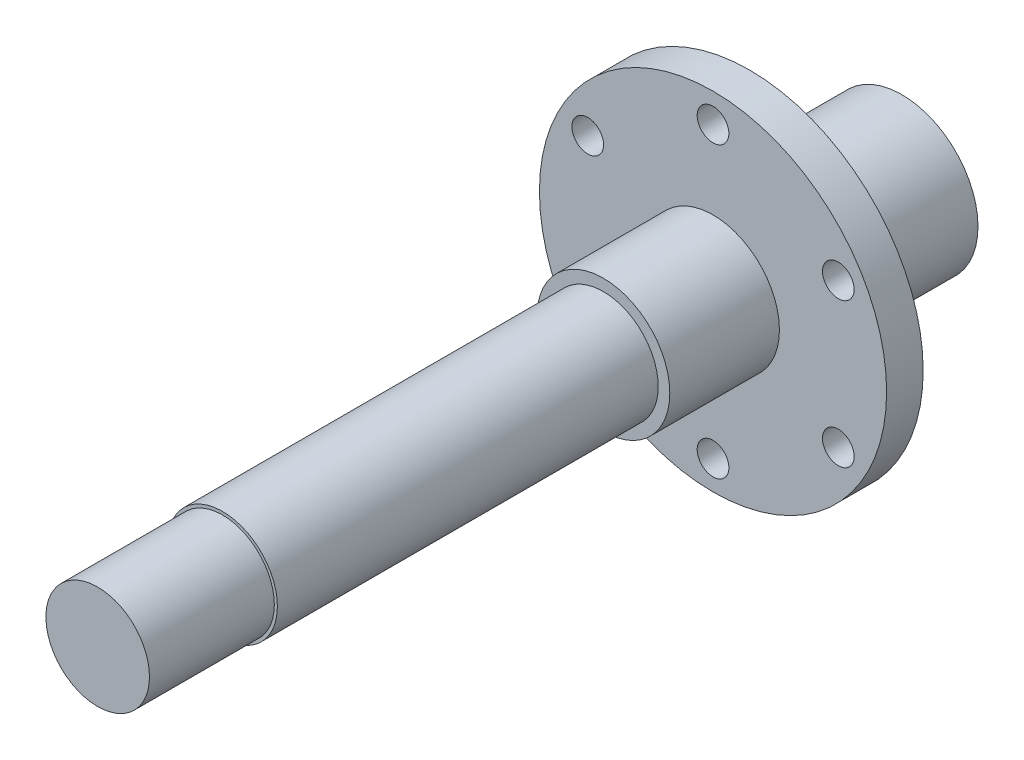
ISO-10303-21;
HEADER;
FILE_DESCRIPTION(('STEP AP214'),'2;1');
FILE_NAME('part.step','',(''),(''),'','','');
FILE_SCHEMA(('AUTOMOTIVE_DESIGN { 1 0 10303 214 1 1 1 1 }'));
ENDSEC;
DATA;
#1=APPLICATION_CONTEXT('core data for automotive mechanical design processes');
#2=APPLICATION_PROTOCOL_DEFINITION('international standard','automotive_design',2000,#1);
#3=PRODUCT_CONTEXT('',#1,'mechanical');
#4=PRODUCT('Part','Part','',(#3));
#5=PRODUCT_RELATED_PRODUCT_CATEGORY('part','',(#4));
#6=PRODUCT_DEFINITION_FORMATION('','',#4);
#7=PRODUCT_DEFINITION_CONTEXT('part definition',#1,'design');
#8=PRODUCT_DEFINITION('design','',#6,#7);
#9=PRODUCT_DEFINITION_SHAPE('','',#8);
#10=(LENGTH_UNIT() NAMED_UNIT(*) SI_UNIT(.MILLI.,.METRE.));
#11=(NAMED_UNIT(*) PLANE_ANGLE_UNIT() SI_UNIT($,.RADIAN.));
#12=(NAMED_UNIT(*) SI_UNIT($,.STERADIAN.) SOLID_ANGLE_UNIT());
#13=UNCERTAINTY_MEASURE_WITH_UNIT(LENGTH_MEASURE(1.E-05),#10,'distance_accuracy_value','');
#14=(GEOMETRIC_REPRESENTATION_CONTEXT(3) GLOBAL_UNCERTAINTY_ASSIGNED_CONTEXT((#13)) GLOBAL_UNIT_ASSIGNED_CONTEXT((#10,
#11,#12)) REPRESENTATION_CONTEXT('',''));
#15=CARTESIAN_POINT('',(0.,0.,0.));
#16=DIRECTION('',(0.,0.,1.));
#17=DIRECTION('',(1.,0.,0.));
#18=AXIS2_PLACEMENT_3D('',#15,#16,#17);
#19=CARTESIAN_POINT('',(0.,0.,25.));
#20=DIRECTION('',(0.,0.,-1.));
#21=DIRECTION('',(-1.,0.,0.));
#22=AXIS2_PLACEMENT_3D('',#19,#20,#21);
#23=CYLINDRICAL_SURFACE('',#22,12.5);
#24=CARTESIAN_POINT('',(0.,-12.5,10.));
#25=CARTESIAN_POINT('',(0.111577020127934,-12.4999981342099,9.99999547136982));
#26=CARTESIAN_POINT('',(0.223216523860334,-12.4984904676373,9.99063139270684));
#27=CARTESIAN_POINT('',(0.443368779658238,-12.4926212341856,9.95343555230202));
#28=CARTESIAN_POINT('',(0.551878486135173,-12.4882569793104,9.92558639609986));
#29=CARTESIAN_POINT('',(0.762553771126289,-12.4771644640129,9.85227911955399));
#30=CARTESIAN_POINT('',(0.864724302944007,-12.4704380773984,9.80683495387921));
#31=CARTESIAN_POINT('',(1.05997584434546,-12.4553623980115,9.69966320560222));
#32=CARTESIAN_POINT('',(1.15305798294893,-12.4470133072085,9.63793764911637));
#33=CARTESIAN_POINT('',(1.32832749604674,-12.4295364290338,9.49937439573757));
#34=CARTESIAN_POINT('',(1.41042286652597,-12.4204030044304,9.42242102105483));
#35=CARTESIAN_POINT('',(1.56059410283783,-12.4024303990938,9.25583553272503));
#36=CARTESIAN_POINT('',(1.62866911690709,-12.393591236265,9.16620264933133));
#37=CARTESIAN_POINT('',(1.74923165413214,-12.377153335782,8.97617611384793));
#38=CARTESIAN_POINT('',(1.80162899846096,-12.369561883485,8.8757245626384));
#39=CARTESIAN_POINT('',(1.88877230962607,-12.3565566594955,8.66730433713119));
#40=CARTESIAN_POINT('',(1.92351937318009,-12.3511427525034,8.55933613036253));
#41=CARTESIAN_POINT('',(1.97408758681328,-12.3431614474236,8.33991962313518));
#42=CARTESIAN_POINT('',(1.990067044504,-12.3405702530036,8.22850868904997));
#43=CARTESIAN_POINT('',(2.00313711337577,-12.3384556715911,8.00455901291456));
#44=CARTESIAN_POINT('',(2.00022895694192,-12.3389320844424,7.89202034492549));
#45=CARTESIAN_POINT('',(1.97573547058135,-12.3428771480604,7.67013496950106));
#46=CARTESIAN_POINT('',(1.95432734726414,-12.3463174079177,7.56076812263896));
#47=CARTESIAN_POINT('',(1.8937194351384,-12.3557581320174,7.34719892890204));
#48=CARTESIAN_POINT('',(1.85451907995672,-12.36175867776,7.2429967465491));
#49=CARTESIAN_POINT('',(1.75925788747206,-12.375674818266,7.04218073214415));
#50=CARTESIAN_POINT('',(1.70312285817509,-12.3835988093069,6.94560270031462));
#51=CARTESIAN_POINT('',(1.57563852632363,-12.4004630811492,6.76316972831466));
#52=CARTESIAN_POINT('',(1.50428809015537,-12.4094034376511,6.67731558787681));
#53=CARTESIAN_POINT('',(1.34742984087892,-12.4274181245254,6.51774119956266));
#54=CARTESIAN_POINT('',(1.26176985545599,-12.4364928200271,6.44417049293121));
#55=CARTESIAN_POINT('',(1.07924037468052,-12.4536592708467,6.31242526115699));
#56=CARTESIAN_POINT('',(0.982370817216379,-12.4617510207175,6.25425082132993));
#57=CARTESIAN_POINT('',(0.78003588830912,-12.4760500569944,6.15493832188602));
#58=CARTESIAN_POINT('',(0.674564267421531,-12.4822559575706,6.11381278273113));
#59=CARTESIAN_POINT('',(0.45808983393977,-12.492072755936,6.04990064207399));
#60=CARTESIAN_POINT('',(0.347087448070729,-12.4956838535962,6.02711262806293));
#61=CARTESIAN_POINT('',(0.123992055401969,-12.4998774645506,6.00072352998704));
#62=CARTESIAN_POINT('',(0.011923933660437,-12.5004923996757,5.99691703404234));
#63=CARTESIAN_POINT('',(-0.211249371511144,-12.4987129750933,6.00805238160926));
#64=CARTESIAN_POINT('',(-0.322354588854289,-12.4963187218055,6.02299356211135));
#65=CARTESIAN_POINT('',(-0.539818798235509,-12.4888100015234,6.07102929818924));
#66=CARTESIAN_POINT('',(-0.646200674402083,-12.4837106780256,6.10402282530455));
#67=CARTESIAN_POINT('',(-0.851922990585996,-12.4713614614776,6.18711946853005));
#68=CARTESIAN_POINT('',(-0.951263060991193,-12.4641114556453,6.2372234819381));
#69=CARTESIAN_POINT('',(-1.14097865112887,-12.4481852151843,6.35359399930331));
#70=CARTESIAN_POINT('',(-1.2312740030957,-12.4394977755831,6.41998963602307));
#71=CARTESIAN_POINT('',(-1.39951415639528,-12.4216959541371,6.56688015436251));
#72=CARTESIAN_POINT('',(-1.47745813440283,-12.4125815438834,6.64737597512825));
#73=CARTESIAN_POINT('',(-1.61953866530001,-12.3948490273074,6.82110038810396));
#74=CARTESIAN_POINT('',(-1.6835368741472,-12.3862364645378,6.91444277878682));
#75=CARTESIAN_POINT('',(-1.7949448921012,-12.3705841030174,7.11067378112033));
#76=CARTESIAN_POINT('',(-1.84235519623835,-12.3635442573346,7.2135621077771));
#77=CARTESIAN_POINT('',(-1.91903158354154,-12.3518754120478,7.42556695921821));
#78=CARTESIAN_POINT('',(-1.94836814902516,-12.3472370587722,7.53465745459787));
#79=CARTESIAN_POINT('',(-1.9882871855446,-12.3408723222072,7.75629756999201));
#80=CARTESIAN_POINT('',(-1.99887114748454,-12.3391457074239,7.86884691429084));
#81=CARTESIAN_POINT('',(-2.00094546618394,-12.3388093758569,8.09282949343662));
#82=CARTESIAN_POINT('',(-1.99265347821446,-12.3401641282165,8.20426071953976));
#83=CARTESIAN_POINT('',(-1.95768017972975,-12.3457602825821,8.42412132262723));
#84=CARTESIAN_POINT('',(-1.93099891577862,-12.3500016772787,8.53255070721189));
#85=CARTESIAN_POINT('',(-1.86008521855063,-12.3608801586201,8.74325535001647));
#86=CARTESIAN_POINT('',(-1.81587007770133,-12.3675148843103,8.84553655764132));
#87=CARTESIAN_POINT('',(-1.71116577284244,-12.3824349767408,9.04126446767307));
#88=CARTESIAN_POINT('',(-1.65067590624507,-12.3907204147391,9.13471078843823));
#89=CARTESIAN_POINT('',(-1.51435663599677,-12.4081216807701,9.31121858083654));
#90=CARTESIAN_POINT('',(-1.43836664580959,-12.417245602178,9.39415524790041));
#91=CARTESIAN_POINT('',(-1.27354334357953,-12.4352300129975,9.54617538139752));
#92=CARTESIAN_POINT('',(-1.18470706402004,-12.44409044097,9.61525563814871));
#93=CARTESIAN_POINT('',(-0.996048346577332,-12.4606140562915,9.73799746617181));
#94=CARTESIAN_POINT('',(-0.896160049794846,-12.4682693265296,9.7915588738874));
#95=CARTESIAN_POINT('',(-0.688725166968654,-12.4814428750468,9.88106129289908));
#96=CARTESIAN_POINT('',(-0.581186461209752,-12.4869633156233,9.91702014310398));
#97=CARTESIAN_POINT('',(-0.394335518838038,-12.4940175589639,9.96234573873548));
#98=CARTESIAN_POINT('',(-0.316163477498691,-12.4962491778317,9.9764439027928));
#99=CARTESIAN_POINT('',(-0.158671480151703,-12.4992410506714,9.99527257286361));
#100=CARTESIAN_POINT('',(-0.0793515415388269,-12.5000013269159,10.0000032206792));
#101=CARTESIAN_POINT('',(0.,-12.5,10.));
#102=B_SPLINE_CURVE_WITH_KNOTS('',3,(#24,#25,#26,#27,#28,#29,#30,#31,#32,#33,#34,#35,#36,#37,
#38,#39,#40,#41,#42,#43,#44,#45,#46,#47,#48,#49,#50,#51,#52,#53,#54,#55,#56,#57,#58,#59,#60,#61,
#62,#63,#64,#65,#66,#67,#68,#69,#70,#71,#72,#73,#74,#75,#76,#77,#78,#79,#80,#81,#82,#83,#84,#85,
#86,#87,#88,#89,#90,#91,#92,#93,#94,#95,#96,#97,#98,#99,#100,#101),.UNSPECIFIED.,.T.,.F.,(4,2,2,
2,2,2,2,2,2,2,2,2,2,2,2,2,2,2,2,2,2,2,2,2,2,2,2,2,2,2,2,2,2,2,2,2,2,2,4),(0.,0.334441046622945,
0.669197249319467,1.00368849765685,1.33813814029104,1.67523334608234,2.0123490250128,
2.35136809625945,2.69036609964137,3.0264835846965,3.36257913887026,3.695490558905,
4.02841257712192,4.36281487068318,4.69724208737484,5.0354831333739,5.37372605363721,
5.71221693636019,6.05068174320194,6.38547572150114,6.72025786018134,7.05318530227048,
7.38613020622256,7.72180459283845,8.0575013456327,8.39639027086604,8.73526908182521,
9.07281785760314,9.41033979575026,9.74398956846142,10.0776384963298,10.4109591848676,
10.7442942653299,11.0812763085405,11.4183363199473,11.7575256865024,12.0963705940352,
12.3342225666999,12.5720709388195),.UNSPECIFIED.);
#103=CARTESIAN_POINT('',(0.,-12.5,10.));
#104=VERTEX_POINT('',#103);
#105=EDGE_CURVE('E108',#104,#104,#102,.T.);
#106=ORIENTED_EDGE('',*,*,#105,.T.);
#107=EDGE_LOOP('',(#106));
#108=FACE_BOUND('',#107,.T.);
#109=CARTESIAN_POINT('',(0.,0.,25.));
#110=DIRECTION('',(0.,0.,1.));
#111=DIRECTION('',(1.,0.,0.));
#112=AXIS2_PLACEMENT_3D('',#109,#110,#111);
#113=CIRCLE('',#112,12.5);
#114=CARTESIAN_POINT('',(12.5,0.,25.));
#115=VERTEX_POINT('',#114);
#116=EDGE_CURVE('E51',#115,#115,#113,.T.);
#117=ORIENTED_EDGE('',*,*,#116,.F.);
#118=EDGE_LOOP('',(#117));
#119=FACE_BOUND('',#118,.T.);
#120=CARTESIAN_POINT('',(0.,0.,0.));
#121=DIRECTION('',(0.,0.,1.));
#122=DIRECTION('',(1.,0.,0.));
#123=AXIS2_PLACEMENT_3D('',#120,#121,#122);
#124=CIRCLE('',#123,12.5);
#125=CARTESIAN_POINT('',(12.5,0.,0.));
#126=VERTEX_POINT('',#125);
#127=EDGE_CURVE('E56',#126,#126,#124,.T.);
#128=ORIENTED_EDGE('',*,*,#127,.T.);
#129=EDGE_LOOP('',(#128));
#130=FACE_BOUND('',#129,.T.);
#131=ADVANCED_FACE('F43',(#108,#119,#130),#23,.T.);
#132=CARTESIAN_POINT('',(0.,0.,0.));
#133=DIRECTION('',(0.,0.,1.));
#134=DIRECTION('',(1.,0.,0.));
#135=AXIS2_PLACEMENT_3D('',#132,#133,#134);
#136=PLANE('',#135);
#137=CARTESIAN_POINT('',(0.,0.,0.));
#138=DIRECTION('',(0.,0.,-1.));
#139=DIRECTION('',(-1.,0.,0.));
#140=AXIS2_PLACEMENT_3D('',#137,#138,#139);
#141=CIRCLE('',#140,5.);
#142=CARTESIAN_POINT('',(-5.,0.,0.));
#143=VERTEX_POINT('',#142);
#144=EDGE_CURVE('E115',#143,#143,#141,.T.);
#145=ORIENTED_EDGE('',*,*,#144,.F.);
#146=EDGE_LOOP('',(#145));
#147=FACE_BOUND('',#146,.T.);
#148=ORIENTED_EDGE('',*,*,#127,.F.);
#149=EDGE_LOOP('',(#148));
#150=FACE_BOUND('',#149,.T.);
#151=ADVANCED_FACE('F138',(#147,#150),#136,.F.);
#152=CARTESIAN_POINT('',(0.,0.,20.));
#153=DIRECTION('',(0.,0.,-1.));
#154=DIRECTION('',(-1.,0.,0.));
#155=AXIS2_PLACEMENT_3D('',#152,#153,#154);
#156=CYLINDRICAL_SURFACE('',#155,5.);
#157=CARTESIAN_POINT('',(0.,-5.,10.));
#158=CARTESIAN_POINT('',(-0.107493005442891,-4.99999271227085,9.99999014817627));
#159=CARTESIAN_POINT('',(-0.215172564090673,-4.99649294306932,9.99128224791162));
#160=CARTESIAN_POINT('',(-0.427496480417896,-4.98283453100641,9.95675229647876));
#161=CARTESIAN_POINT('',(-0.532131777561248,-4.97265778698877,9.93088372091387));
#162=CARTESIAN_POINT('',(-0.734953922727403,-4.94674209213118,9.86312392194117));
#163=CARTESIAN_POINT('',(-0.833160661616958,-4.93102136364072,9.82128515378327));
#164=CARTESIAN_POINT('',(-1.02107197032837,-4.89556610796078,9.72298082667345));
#165=CARTESIAN_POINT('',(-1.11077947675099,-4.87583297458057,9.66652034508107));
#166=CARTESIAN_POINT('',(-1.28350100757039,-4.83330886170419,9.53776450143906));
#167=CARTESIAN_POINT('',(-1.36606227255021,-4.81042296929191,9.46489334375974));
#168=CARTESIAN_POINT('',(-1.51817500478472,-4.76460576906195,9.30659999652322));
#169=CARTESIAN_POINT('',(-1.58772010713353,-4.74167444453792,9.22117170278826));
#170=CARTESIAN_POINT('',(-1.71487456729288,-4.69722791797136,9.03557192975773));
#171=CARTESIAN_POINT('',(-1.77181498119547,-4.67582115964951,8.9349135139768));
#172=CARTESIAN_POINT('',(-1.86775471903715,-4.63833647186792,8.72446360157996));
#173=CARTESIAN_POINT('',(-1.90676256428583,-4.62225601244176,8.61467647215164));
#174=CARTESIAN_POINT('',(-1.96389882339587,-4.59826357660818,8.3942876664079));
#175=CARTESIAN_POINT('',(-1.98289396580565,-4.59001420355605,8.28394876442379));
#176=CARTESIAN_POINT('',(-2.00217296164003,-4.58164004049144,8.06136500169273));
#177=CARTESIAN_POINT('',(-2.00246601631322,-4.58151125522768,7.94912110537499));
#178=CARTESIAN_POINT('',(-1.98498936750454,-4.58910500279994,7.73424332854196));
#179=CARTESIAN_POINT('',(-1.96847531430514,-4.5962817503845,7.63148428559097));
#180=CARTESIAN_POINT('',(-1.91994688029782,-4.61676187607836,7.43034044399329));
#181=CARTESIAN_POINT('',(-1.88792979480463,-4.63006632321673,7.33195641188969));
#182=CARTESIAN_POINT('',(-1.80869473255107,-4.6615948508853,7.13998216380396));
#183=CARTESIAN_POINT('',(-1.76117986231532,-4.67991379280788,7.04653076094531));
#184=CARTESIAN_POINT('',(-1.65250646073221,-4.7193811638989,6.86858418363844));
#185=CARTESIAN_POINT('',(-1.59134280510084,-4.74053065456848,6.78409239059719));
#186=CARTESIAN_POINT('',(-1.45155059945443,-4.78526736742271,6.619590271198));
#187=CARTESIAN_POINT('',(-1.37193746297063,-4.80891664976152,6.54043127055398));
#188=CARTESIAN_POINT('',(-1.20031442743019,-4.85459824958282,6.39631552199796));
#189=CARTESIAN_POINT('',(-1.10830206533443,-4.87663024445325,6.33136160258971));
#190=CARTESIAN_POINT('',(-0.912077652605843,-4.91714681264548,6.21638255258417));
#191=CARTESIAN_POINT('',(-0.807660491346477,-4.93555270095415,6.16667771880295));
#192=CARTESIAN_POINT('',(-0.591023765482882,-4.96614828328759,6.08583213892194));
#193=CARTESIAN_POINT('',(-0.478808196849674,-4.97834113462382,6.05468196244259));
#194=CARTESIAN_POINT('',(-0.25689588760782,-4.99456139506911,6.0135517045803));
#195=CARTESIAN_POINT('',(-0.147443293985534,-4.99902945833514,6.00242754574644));
#196=CARTESIAN_POINT('',(0.0718453098078172,-5.00068478510631,5.99828689947139));
#197=CARTESIAN_POINT('',(0.181681213223924,-4.99787393582291,6.00526571845249));
#198=CARTESIAN_POINT('',(0.393432739121987,-4.98557567063753,6.03629175255199));
#199=CARTESIAN_POINT('',(0.495482491775474,-4.97639391345523,6.05955798035098));
#200=CARTESIAN_POINT('',(0.69413542806078,-4.952594414055,6.12143570830981));
#201=CARTESIAN_POINT('',(0.790737910224844,-4.9379759735653,6.16004917966868));
#202=CARTESIAN_POINT('',(0.979078785816702,-4.90416594770812,6.25278493967995));
#203=CARTESIAN_POINT('',(1.07057802275541,-4.88484815979804,6.30734547204315));
#204=CARTESIAN_POINT('',(1.24344359124656,-4.84373364745525,6.42994032390564));
#205=CARTESIAN_POINT('',(1.32480584076113,-4.8219359311027,6.49798004292261));
#206=CARTESIAN_POINT('',(1.48072304302882,-4.77645117638112,6.65087001294963));
#207=CARTESIAN_POINT('',(1.55447393380606,-4.75273441425052,6.73653354150621));
#208=CARTESIAN_POINT('',(1.68675119741371,-4.70741672917132,6.91944008300937));
#209=CARTESIAN_POINT('',(1.74527506133751,-4.68581615526511,7.01668500033995));
#210=CARTESIAN_POINT('',(1.84580750193163,-4.64714299907709,7.22146169459411));
#211=CARTESIAN_POINT('',(1.88765059453445,-4.63011630884788,7.32908399921231));
#212=CARTESIAN_POINT('',(1.9522962197053,-4.60323673477932,7.55073365171516));
#213=CARTESIAN_POINT('',(1.97511280526932,-4.59337855695998,7.66475620581243));
#214=CARTESIAN_POINT('',(1.9997156172784,-4.58271759299926,7.88712790177454));
#215=CARTESIAN_POINT('',(2.00289708230287,-4.58131421008171,7.99529483959335));
#216=CARTESIAN_POINT('',(1.99180315927752,-4.58614836033098,8.21054485771329));
#217=CARTESIAN_POINT('',(1.97752998791378,-4.59238492324793,8.31762807390258));
#218=CARTESIAN_POINT('',(1.93307136615365,-4.61126649079021,8.52333218985504));
#219=CARTESIAN_POINT('',(1.90353749357098,-4.62364831827449,8.622120274433));
#220=CARTESIAN_POINT('',(1.83000544849101,-4.65324001232697,8.81337862961348));
#221=CARTESIAN_POINT('',(1.78600328139381,-4.67045121206007,8.90584714689983));
#222=CARTESIAN_POINT('',(1.68187276275973,-4.70898609604491,9.08760961927078));
#223=CARTESIAN_POINT('',(1.62096533515949,-4.73048882313242,9.17641867013048));
#224=CARTESIAN_POINT('',(1.4858921192715,-4.77463804372237,9.34299331720375));
#225=CARTESIAN_POINT('',(1.41172233481812,-4.79728488048406,9.42075557212831));
#226=CARTESIAN_POINT('',(1.24650550627246,-4.84293567087394,9.56820285326362));
#227=CARTESIAN_POINT('',(1.15467600114614,-4.86586757962185,9.63703730689807));
#228=CARTESIAN_POINT('',(0.959900320285779,-4.90800406713717,9.75833704262164));
#229=CARTESIAN_POINT('',(0.856949004547237,-4.92720691092906,9.81079471215253));
#230=CARTESIAN_POINT('',(0.644738062495202,-4.95939714815861,9.89662221519029));
#231=CARTESIAN_POINT('',(0.535631618219695,-4.97249363055028,9.93032932356034));
#232=CARTESIAN_POINT('',(0.312876546281219,-4.99144306209366,9.97863912095427));
#233=CARTESIAN_POINT('',(0.199243525858912,-4.99731899495638,9.9933024367439));
#234=CARTESIAN_POINT('',(0.0569122978909291,-4.99975899504136,9.99939538097827));
#235=CARTESIAN_POINT('',(0.0284626887407581,-5.00000192969176,10.0000026086292));
#236=CARTESIAN_POINT('',(0.,-5.,10.));
#237=B_SPLINE_CURVE_WITH_KNOTS('',3,(#157,#158,#159,#160,#161,#162,#163,#164,#165,#166,#167,
#168,#169,#170,#171,#172,#173,#174,#175,#176,#177,#178,#179,#180,#181,#182,#183,#184,#185,#186,
#187,#188,#189,#190,#191,#192,#193,#194,#195,#196,#197,#198,#199,#200,#201,#202,#203,#204,#205,
#206,#207,#208,#209,#210,#211,#212,#213,#214,#215,#216,#217,#218,#219,#220,#221,#222,#223,#224,
#225,#226,#227,#228,#229,#230,#231,#232,#233,#234,#235,#236),.UNSPECIFIED.,.T.,.F.,(4,2,2,2,2,2,
2,2,2,2,2,2,2,2,2,2,2,2,2,2,2,2,2,2,2,2,2,2,2,2,2,2,2,2,2,2,2,2,2,4),(0.,0.322402987893071,
0.645683636007934,0.96791145747158,1.29002753567984,1.62597381700397,1.96208394934411,
2.31315258819217,2.66405423118268,2.99904105308829,3.33386306340488,3.64538328401372,
3.95695787256047,4.27489126298816,4.59294421938183,4.93558349186557,5.27829092839733,
5.62776913162806,5.9770695611379,6.30569184528007,6.63422893570082,6.94800455564365,
7.26182048993796,7.58523513398262,7.90877959498969,8.25368474624413,8.59864669043748,
8.94695045140828,9.29499672645934,9.61799673392748,9.94095572563045,10.2511431854877,
10.5614163580516,10.8894546805669,11.2175920134839,11.5670042353384,11.9165786364053,
12.2596430101332,12.6016125240434,12.686980458968),.UNSPECIFIED.);
#238=CARTESIAN_POINT('',(0.,-5.,10.));
#239=VERTEX_POINT('',#238);
#240=EDGE_CURVE('E105',#239,#239,#237,.T.);
#241=ORIENTED_EDGE('',*,*,#240,.T.);
#242=EDGE_LOOP('',(#241));
#243=FACE_BOUND('',#242,.T.);
#244=CARTESIAN_POINT('',(0.,0.,20.));
#245=DIRECTION('',(0.,0.,-1.));
#246=DIRECTION('',(-1.,0.,0.));
#247=AXIS2_PLACEMENT_3D('',#244,#245,#246);
#248=CIRCLE('',#247,5.);
#249=CARTESIAN_POINT('',(-5.,0.,20.));
#250=VERTEX_POINT('',#249);
#251=EDGE_CURVE('E116',#250,#250,#248,.T.);
#252=ORIENTED_EDGE('',*,*,#251,.F.);
#253=EDGE_LOOP('',(#252));
#254=FACE_BOUND('',#253,.T.);
#255=ORIENTED_EDGE('',*,*,#144,.T.);
#256=EDGE_LOOP('',(#255));
#257=FACE_BOUND('',#256,.T.);
#258=ADVANCED_FACE('F135',(#243,#254,#257),#156,.F.);
#259=CARTESIAN_POINT('',(0.,0.,20.));
#260=DIRECTION('',(0.,0.,-1.));
#261=DIRECTION('',(-1.,0.,0.));
#262=AXIS2_PLACEMENT_3D('',#259,#260,#261);
#263=PLANE('',#262);
#264=ORIENTED_EDGE('',*,*,#251,.T.);
#265=EDGE_LOOP('',(#264));
#266=FACE_BOUND('',#265,.T.);
#267=ADVANCED_FACE('F124',(#266),#263,.T.);
#268=CARTESIAN_POINT('',(0.,-20.,8.));
#269=DIRECTION('',(0.,1.,0.));
#270=DIRECTION('',(0.,0.,1.));
#271=AXIS2_PLACEMENT_3D('',#268,#269,#270);
#272=CYLINDRICAL_SURFACE('',#271,2.);
#273=ORIENTED_EDGE('',*,*,#240,.F.);
#274=EDGE_LOOP('',(#273));
#275=FACE_BOUND('',#274,.T.);
#276=ORIENTED_EDGE('',*,*,#105,.F.);
#277=EDGE_LOOP('',(#276));
#278=FACE_BOUND('',#277,.T.);
#279=ADVANCED_FACE('F118',(#275,#278),#272,.F.);
#280=CARTESIAN_POINT('',(0.,0.,31.));
#281=DIRECTION('',(0.,0.,1.));
#282=DIRECTION('',(1.,0.,0.));
#283=AXIS2_PLACEMENT_3D('',#280,#281,#282);
#284=PLANE('',#283);
#285=CARTESIAN_POINT('',(0.,0.,31.));
#286=DIRECTION('',(0.,0.,1.));
#287=DIRECTION('',(1.,0.,0.));
#288=AXIS2_PLACEMENT_3D('',#285,#286,#287);
#289=CIRCLE('',#288,10.9);
#290=CARTESIAN_POINT('',(10.9,0.,31.));
#291=VERTEX_POINT('',#290);
#292=EDGE_CURVE('E340',#291,#291,#289,.T.);
#293=ORIENTED_EDGE('',*,*,#292,.F.);
#294=EDGE_LOOP('',(#293));
#295=FACE_BOUND('',#294,.T.);
#296=CARTESIAN_POINT('',(-20.5681033398789,-11.8750000000009,31.));
#297=DIRECTION('',(0.,0.,1.));
#298=DIRECTION('',(1.,0.,0.));
#299=AXIS2_PLACEMENT_3D('',#296,#297,#298);
#300=CIRCLE('',#299,2.6);
#301=CARTESIAN_POINT('',(-17.9681033398789,-11.8750000000009,31.));
#302=VERTEX_POINT('',#301);
#303=EDGE_CURVE('E72',#302,#302,#300,.T.);
#304=ORIENTED_EDGE('',*,*,#303,.F.);
#305=EDGE_LOOP('',(#304));
#306=FACE_BOUND('',#305,.T.);
#307=CARTESIAN_POINT('',(20.5681033398819,-11.8749999999991,31.));
#308=DIRECTION('',(0.,0.,1.));
#309=DIRECTION('',(1.,0.,0.));
#310=AXIS2_PLACEMENT_3D('',#307,#308,#309);
#311=CIRCLE('',#310,2.6);
#312=CARTESIAN_POINT('',(23.1681033398819,-11.8749999999991,31.));
#313=VERTEX_POINT('',#312);
#314=EDGE_CURVE('E84',#313,#313,#311,.T.);
#315=ORIENTED_EDGE('',*,*,#314,.F.);
#316=EDGE_LOOP('',(#315));
#317=FACE_BOUND('',#316,.T.);
#318=CARTESIAN_POINT('',(0.,23.75,31.));
#319=DIRECTION('',(0.,0.,1.));
#320=DIRECTION('',(1.,0.,0.));
#321=AXIS2_PLACEMENT_3D('',#318,#319,#320);
#322=CIRCLE('',#321,2.6);
#323=CARTESIAN_POINT('',(2.6,23.75,31.));
#324=VERTEX_POINT('',#323);
#325=EDGE_CURVE('E96',#324,#324,#322,.T.);
#326=ORIENTED_EDGE('',*,*,#325,.F.);
#327=EDGE_LOOP('',(#326));
#328=FACE_BOUND('',#327,.T.);
#329=CARTESIAN_POINT('',(0.,0.,31.));
#330=DIRECTION('',(0.,0.,1.));
#331=DIRECTION('',(1.,0.,0.));
#332=AXIS2_PLACEMENT_3D('',#329,#330,#331);
#333=CIRCLE('',#332,28.5);
#334=CARTESIAN_POINT('',(28.5,0.,31.));
#335=VERTEX_POINT('',#334);
#336=EDGE_CURVE('E102',#335,#335,#333,.T.);
#337=ORIENTED_EDGE('',*,*,#336,.T.);
#338=EDGE_LOOP('',(#337));
#339=FACE_BOUND('',#338,.T.);
#340=CARTESIAN_POINT('',(20.5681033398809,11.8750000000009,31.));
#341=DIRECTION('',(0.,0.,1.));
#342=DIRECTION('',(1.,0.,0.));
#343=AXIS2_PLACEMENT_3D('',#340,#341,#342);
#344=CIRCLE('',#343,2.6);
#345=CARTESIAN_POINT('',(23.1681033398809,11.8750000000009,31.));
#346=VERTEX_POINT('',#345);
#347=EDGE_CURVE('E90',#346,#346,#344,.T.);
#348=ORIENTED_EDGE('',*,*,#347,.F.);
#349=EDGE_LOOP('',(#348));
#350=FACE_BOUND('',#349,.T.);
#351=CARTESIAN_POINT('',(2.01632118847236E-12,-23.75,31.));
#352=DIRECTION('',(0.,0.,1.));
#353=DIRECTION('',(1.,0.,0.));
#354=AXIS2_PLACEMENT_3D('',#351,#352,#353);
#355=CIRCLE('',#354,2.6);
#356=CARTESIAN_POINT('',(2.60000000000202,-23.75,31.));
#357=VERTEX_POINT('',#356);
#358=EDGE_CURVE('E78',#357,#357,#355,.T.);
#359=ORIENTED_EDGE('',*,*,#358,.F.);
#360=EDGE_LOOP('',(#359));
#361=FACE_BOUND('',#360,.T.);
#362=CARTESIAN_POINT('',(-20.5681033398799,11.8749999999991,31.));
#363=DIRECTION('',(0.,0.,1.));
#364=DIRECTION('',(1.,0.,0.));
#365=AXIS2_PLACEMENT_3D('',#362,#363,#364);
#366=CIRCLE('',#365,2.6);
#367=CARTESIAN_POINT('',(-17.9681033398799,11.8749999999991,31.));
#368=VERTEX_POINT('',#367);
#369=EDGE_CURVE('E66',#368,#368,#366,.T.);
#370=ORIENTED_EDGE('',*,*,#369,.F.);
#371=EDGE_LOOP('',(#370));
#372=FACE_BOUND('',#371,.T.);
#373=ADVANCED_FACE('F123',(#295,#306,#317,#328,#339,#350,#361,#372),#284,.T.);
#374=CARTESIAN_POINT('',(0.,0.,25.));
#375=DIRECTION('',(0.,0.,1.));
#376=DIRECTION('',(1.,0.,0.));
#377=AXIS2_PLACEMENT_3D('',#374,#375,#376);
#378=PLANE('',#377);
#379=ORIENTED_EDGE('',*,*,#116,.T.);
#380=EDGE_LOOP('',(#379));
#381=FACE_BOUND('',#380,.T.);
#382=CARTESIAN_POINT('',(0.,0.,25.));
#383=DIRECTION('',(0.,0.,1.));
#384=DIRECTION('',(1.,0.,0.));
#385=AXIS2_PLACEMENT_3D('',#382,#383,#384);
#386=CIRCLE('',#385,28.5);
#387=CARTESIAN_POINT('',(28.5,0.,25.));
#388=VERTEX_POINT('',#387);
#389=EDGE_CURVE('E99',#388,#388,#386,.T.);
#390=ORIENTED_EDGE('',*,*,#389,.F.);
#391=EDGE_LOOP('',(#390));
#392=FACE_BOUND('',#391,.T.);
#393=CARTESIAN_POINT('',(0.,23.75,25.));
#394=DIRECTION('',(0.,0.,1.));
#395=DIRECTION('',(1.,0.,0.));
#396=AXIS2_PLACEMENT_3D('',#393,#394,#395);
#397=CIRCLE('',#396,2.6);
#398=CARTESIAN_POINT('',(2.6,23.75,25.));
#399=VERTEX_POINT('',#398);
#400=EDGE_CURVE('E93',#399,#399,#397,.T.);
#401=ORIENTED_EDGE('',*,*,#400,.T.);
#402=EDGE_LOOP('',(#401));
#403=FACE_BOUND('',#402,.T.);
#404=CARTESIAN_POINT('',(20.5681033398809,11.8750000000009,25.));
#405=DIRECTION('',(0.,0.,1.));
#406=DIRECTION('',(1.,0.,0.));
#407=AXIS2_PLACEMENT_3D('',#404,#405,#406);
#408=CIRCLE('',#407,2.6);
#409=CARTESIAN_POINT('',(23.1681033398809,11.8750000000009,25.));
#410=VERTEX_POINT('',#409);
#411=EDGE_CURVE('E87',#410,#410,#408,.T.);
#412=ORIENTED_EDGE('',*,*,#411,.T.);
#413=EDGE_LOOP('',(#412));
#414=FACE_BOUND('',#413,.T.);
#415=CARTESIAN_POINT('',(20.5681033398819,-11.8749999999991,25.));
#416=DIRECTION('',(0.,0.,1.));
#417=DIRECTION('',(1.,0.,0.));
#418=AXIS2_PLACEMENT_3D('',#415,#416,#417);
#419=CIRCLE('',#418,2.6);
#420=CARTESIAN_POINT('',(23.1681033398819,-11.8749999999991,25.));
#421=VERTEX_POINT('',#420);
#422=EDGE_CURVE('E81',#421,#421,#419,.T.);
#423=ORIENTED_EDGE('',*,*,#422,.T.);
#424=EDGE_LOOP('',(#423));
#425=FACE_BOUND('',#424,.T.);
#426=CARTESIAN_POINT('',(2.01632118847236E-12,-23.75,25.));
#427=DIRECTION('',(0.,0.,1.));
#428=DIRECTION('',(1.,0.,0.));
#429=AXIS2_PLACEMENT_3D('',#426,#427,#428);
#430=CIRCLE('',#429,2.6);
#431=CARTESIAN_POINT('',(2.60000000000202,-23.75,25.));
#432=VERTEX_POINT('',#431);
#433=EDGE_CURVE('E75',#432,#432,#430,.T.);
#434=ORIENTED_EDGE('',*,*,#433,.T.);
#435=EDGE_LOOP('',(#434));
#436=FACE_BOUND('',#435,.T.);
#437=CARTESIAN_POINT('',(-20.5681033398789,-11.8750000000009,25.));
#438=DIRECTION('',(0.,0.,1.));
#439=DIRECTION('',(1.,0.,0.));
#440=AXIS2_PLACEMENT_3D('',#437,#438,#439);
#441=CIRCLE('',#440,2.6);
#442=CARTESIAN_POINT('',(-17.9681033398789,-11.8750000000009,25.));
#443=VERTEX_POINT('',#442);
#444=EDGE_CURVE('E69',#443,#443,#441,.T.);
#445=ORIENTED_EDGE('',*,*,#444,.T.);
#446=EDGE_LOOP('',(#445));
#447=FACE_BOUND('',#446,.T.);
#448=CARTESIAN_POINT('',(-20.5681033398799,11.8749999999991,25.));
#449=DIRECTION('',(0.,0.,1.));
#450=DIRECTION('',(1.,0.,0.));
#451=AXIS2_PLACEMENT_3D('',#448,#449,#450);
#452=CIRCLE('',#451,2.6);
#453=CARTESIAN_POINT('',(-17.9681033398799,11.8749999999991,25.));
#454=VERTEX_POINT('',#453);
#455=EDGE_CURVE('E65',#454,#454,#452,.T.);
#456=ORIENTED_EDGE('',*,*,#455,.T.);
#457=EDGE_LOOP('',(#456));
#458=FACE_BOUND('',#457,.T.);
#459=ADVANCED_FACE('F175',(#381,#392,#403,#414,#425,#436,#447,#458),#378,.F.);
#460=CARTESIAN_POINT('',(0.,0.,31.));
#461=DIRECTION('',(0.,0.,-1.));
#462=DIRECTION('',(-1.,0.,0.));
#463=AXIS2_PLACEMENT_3D('',#460,#461,#462);
#464=CYLINDRICAL_SURFACE('',#463,28.5);
#465=ORIENTED_EDGE('',*,*,#336,.F.);
#466=EDGE_LOOP('',(#465));
#467=FACE_BOUND('',#466,.T.);
#468=ORIENTED_EDGE('',*,*,#389,.T.);
#469=EDGE_LOOP('',(#468));
#470=FACE_BOUND('',#469,.T.);
#471=ADVANCED_FACE('F126',(#467,#470),#464,.T.);
#472=CARTESIAN_POINT('',(0.,23.75,31.));
#473=DIRECTION('',(0.,0.,-1.));
#474=DIRECTION('',(-1.,0.,0.));
#475=AXIS2_PLACEMENT_3D('',#472,#473,#474);
#476=CYLINDRICAL_SURFACE('',#475,2.6);
#477=ORIENTED_EDGE('',*,*,#325,.T.);
#478=EDGE_LOOP('',(#477));
#479=FACE_BOUND('',#478,.T.);
#480=ORIENTED_EDGE('',*,*,#400,.F.);
#481=EDGE_LOOP('',(#480));
#482=FACE_BOUND('',#481,.T.);
#483=ADVANCED_FACE('F190',(#479,#482),#476,.F.);
#484=CARTESIAN_POINT('',(20.5681033398809,11.8750000000009,31.));
#485=DIRECTION('',(0.,0.,-1.));
#486=DIRECTION('',(-1.,0.,0.));
#487=AXIS2_PLACEMENT_3D('',#484,#485,#486);
#488=CYLINDRICAL_SURFACE('',#487,2.6);
#489=ORIENTED_EDGE('',*,*,#347,.T.);
#490=EDGE_LOOP('',(#489));
#491=FACE_BOUND('',#490,.T.);
#492=ORIENTED_EDGE('',*,*,#411,.F.);
#493=EDGE_LOOP('',(#492));
#494=FACE_BOUND('',#493,.T.);
#495=ADVANCED_FACE('F197',(#491,#494),#488,.F.);
#496=CARTESIAN_POINT('',(20.5681033398819,-11.8749999999991,31.));
#497=DIRECTION('',(0.,0.,-1.));
#498=DIRECTION('',(-1.,0.,0.));
#499=AXIS2_PLACEMENT_3D('',#496,#497,#498);
#500=CYLINDRICAL_SURFACE('',#499,2.6);
#501=ORIENTED_EDGE('',*,*,#314,.T.);
#502=EDGE_LOOP('',(#501));
#503=FACE_BOUND('',#502,.T.);
#504=ORIENTED_EDGE('',*,*,#422,.F.);
#505=EDGE_LOOP('',(#504));
#506=FACE_BOUND('',#505,.T.);
#507=ADVANCED_FACE('F205',(#503,#506),#500,.F.);
#508=CARTESIAN_POINT('',(2.01632118847236E-12,-23.75,31.));
#509=DIRECTION('',(0.,0.,-1.));
#510=DIRECTION('',(-1.,0.,0.));
#511=AXIS2_PLACEMENT_3D('',#508,#509,#510);
#512=CYLINDRICAL_SURFACE('',#511,2.6);
#513=ORIENTED_EDGE('',*,*,#358,.T.);
#514=EDGE_LOOP('',(#513));
#515=FACE_BOUND('',#514,.T.);
#516=ORIENTED_EDGE('',*,*,#433,.F.);
#517=EDGE_LOOP('',(#516));
#518=FACE_BOUND('',#517,.T.);
#519=ADVANCED_FACE('F213',(#515,#518),#512,.F.);
#520=CARTESIAN_POINT('',(-20.5681033398789,-11.8750000000009,31.));
#521=DIRECTION('',(0.,0.,-1.));
#522=DIRECTION('',(-1.,0.,0.));
#523=AXIS2_PLACEMENT_3D('',#520,#521,#522);
#524=CYLINDRICAL_SURFACE('',#523,2.6);
#525=ORIENTED_EDGE('',*,*,#303,.T.);
#526=EDGE_LOOP('',(#525));
#527=FACE_BOUND('',#526,.T.);
#528=ORIENTED_EDGE('',*,*,#444,.F.);
#529=EDGE_LOOP('',(#528));
#530=FACE_BOUND('',#529,.T.);
#531=ADVANCED_FACE('F221',(#527,#530),#524,.F.);
#532=CARTESIAN_POINT('',(-20.5681033398799,11.8749999999991,31.));
#533=DIRECTION('',(0.,0.,-1.));
#534=DIRECTION('',(-1.,0.,0.));
#535=AXIS2_PLACEMENT_3D('',#532,#533,#534);
#536=CYLINDRICAL_SURFACE('',#535,2.6);
#537=ORIENTED_EDGE('',*,*,#369,.T.);
#538=EDGE_LOOP('',(#537));
#539=FACE_BOUND('',#538,.T.);
#540=ORIENTED_EDGE('',*,*,#455,.F.);
#541=EDGE_LOOP('',(#540));
#542=FACE_BOUND('',#541,.T.);
#543=ADVANCED_FACE('F229',(#539,#542),#536,.F.);
#544=CARTESIAN_POINT('',(0.,0.,49.));
#545=DIRECTION('',(0.,0.,-1.));
#546=DIRECTION('',(-1.,0.,0.));
#547=AXIS2_PLACEMENT_3D('',#544,#545,#546);
#548=CYLINDRICAL_SURFACE('',#547,10.9);
#549=CARTESIAN_POINT('',(0.,0.,49.));
#550=DIRECTION('',(0.,0.,1.));
#551=DIRECTION('',(1.,0.,0.));
#552=AXIS2_PLACEMENT_3D('',#549,#550,#551);
#553=CIRCLE('',#552,10.9);
#554=CARTESIAN_POINT('',(10.9,0.,49.));
#555=VERTEX_POINT('',#554);
#556=EDGE_CURVE('E337',#555,#555,#553,.T.);
#557=ORIENTED_EDGE('',*,*,#556,.F.);
#558=EDGE_LOOP('',(#557));
#559=FACE_BOUND('',#558,.T.);
#560=ORIENTED_EDGE('',*,*,#292,.T.);
#561=EDGE_LOOP('',(#560));
#562=FACE_BOUND('',#561,.T.);
#563=ADVANCED_FACE('F237',(#559,#562),#548,.T.);
#564=CARTESIAN_POINT('',(0.,0.,49.));
#565=DIRECTION('',(0.,0.,1.));
#566=DIRECTION('',(1.,0.,0.));
#567=AXIS2_PLACEMENT_3D('',#564,#565,#566);
#568=PLANE('',#567);
#569=CARTESIAN_POINT('',(0.,0.,49.));
#570=DIRECTION('',(0.,0.,1.));
#571=DIRECTION('',(1.,0.,0.));
#572=AXIS2_PLACEMENT_3D('',#569,#570,#571);
#573=CIRCLE('',#572,9.);
#574=CARTESIAN_POINT('',(9.,0.,49.));
#575=VERTEX_POINT('',#574);
#576=EDGE_CURVE('E47',#575,#575,#573,.T.);
#577=ORIENTED_EDGE('',*,*,#576,.F.);
#578=EDGE_LOOP('',(#577));
#579=FACE_BOUND('',#578,.T.);
#580=ORIENTED_EDGE('',*,*,#556,.T.);
#581=EDGE_LOOP('',(#580));
#582=FACE_BOUND('',#581,.T.);
#583=ADVANCED_FACE('F245',(#579,#582),#568,.T.);
#584=CARTESIAN_POINT('',(0.,0.,132.02));
#585=DIRECTION('',(0.,0.,1.));
#586=DIRECTION('',(1.,0.,0.));
#587=AXIS2_PLACEMENT_3D('',#584,#585,#586);
#588=PLANE('',#587);
#589=CARTESIAN_POINT('',(0.,0.,132.02));
#590=DIRECTION('',(0.,0.,1.));
#591=DIRECTION('',(1.,0.,0.));
#592=AXIS2_PLACEMENT_3D('',#589,#590,#591);
#593=CIRCLE('',#592,8.5);
#594=CARTESIAN_POINT('',(8.5,0.,132.02));
#595=VERTEX_POINT('',#594);
#596=EDGE_CURVE('E60',#595,#595,#593,.T.);
#597=ORIENTED_EDGE('',*,*,#596,.T.);
#598=EDGE_LOOP('',(#597));
#599=FACE_BOUND('',#598,.T.);
#600=ADVANCED_FACE('F253',(#599),#588,.T.);
#601=CARTESIAN_POINT('',(0.,0.,132.02));
#602=DIRECTION('',(0.,0.,-1.));
#603=DIRECTION('',(-1.,0.,0.));
#604=AXIS2_PLACEMENT_3D('',#601,#602,#603);
#605=CYLINDRICAL_SURFACE('',#604,8.5);
#606=ORIENTED_EDGE('',*,*,#596,.F.);
#607=EDGE_LOOP('',(#606));
#608=FACE_BOUND('',#607,.T.);
#609=CARTESIAN_POINT('',(0.,0.,111.52));
#610=DIRECTION('',(0.,0.,1.));
#611=DIRECTION('',(1.,0.,0.));
#612=AXIS2_PLACEMENT_3D('',#609,#610,#611);
#613=CIRCLE('',#612,8.5);
#614=CARTESIAN_POINT('',(8.5,0.,111.52));
#615=VERTEX_POINT('',#614);
#616=EDGE_CURVE('E12',#615,#615,#613,.T.);
#617=ORIENTED_EDGE('',*,*,#616,.T.);
#618=EDGE_LOOP('',(#617));
#619=FACE_BOUND('',#618,.T.);
#620=ADVANCED_FACE('F261',(#608,#619),#605,.T.);
#621=CARTESIAN_POINT('',(0.,0.,111.52));
#622=DIRECTION('',(0.,0.,1.));
#623=DIRECTION('',(1.,0.,0.));
#624=AXIS2_PLACEMENT_3D('',#621,#622,#623);
#625=PLANE('',#624);
#626=ORIENTED_EDGE('',*,*,#616,.F.);
#627=EDGE_LOOP('',(#626));
#628=FACE_BOUND('',#627,.T.);
#629=CARTESIAN_POINT('',(0.,0.,111.52));
#630=DIRECTION('',(0.,0.,1.));
#631=DIRECTION('',(1.,0.,0.));
#632=AXIS2_PLACEMENT_3D('',#629,#630,#631);
#633=CIRCLE('',#632,9.);
#634=CARTESIAN_POINT('',(9.,0.,111.52));
#635=VERTEX_POINT('',#634);
#636=EDGE_CURVE('E62',#635,#635,#633,.T.);
#637=ORIENTED_EDGE('',*,*,#636,.T.);
#638=EDGE_LOOP('',(#637));
#639=FACE_BOUND('',#638,.T.);
#640=ADVANCED_FACE('F269',(#628,#639),#625,.T.);
#641=CARTESIAN_POINT('',(0.,0.,111.52));
#642=DIRECTION('',(0.,0.,-1.));
#643=DIRECTION('',(-1.,0.,0.));
#644=AXIS2_PLACEMENT_3D('',#641,#642,#643);
#645=CYLINDRICAL_SURFACE('',#644,9.);
#646=ORIENTED_EDGE('',*,*,#576,.T.);
#647=EDGE_LOOP('',(#646));
#648=FACE_BOUND('',#647,.T.);
#649=ORIENTED_EDGE('',*,*,#636,.F.);
#650=EDGE_LOOP('',(#649));
#651=FACE_BOUND('',#650,.T.);
#652=ADVANCED_FACE('F276',(#648,#651),#645,.T.);
#653=CLOSED_SHELL('',(#131,#151,#258,#267,#279,#373,#459,#471,#483,#495,#507,#519,#531,#543,
#563,#583,#600,#620,#640,#652));
#654=MANIFOLD_SOLID_BREP('B2',#653);
#655=ADVANCED_BREP_SHAPE_REPRESENTATION('',(#18,#654),#14);
#656=SHAPE_DEFINITION_REPRESENTATION(#9,#655);
ENDSEC;
END-ISO-10303-21;
